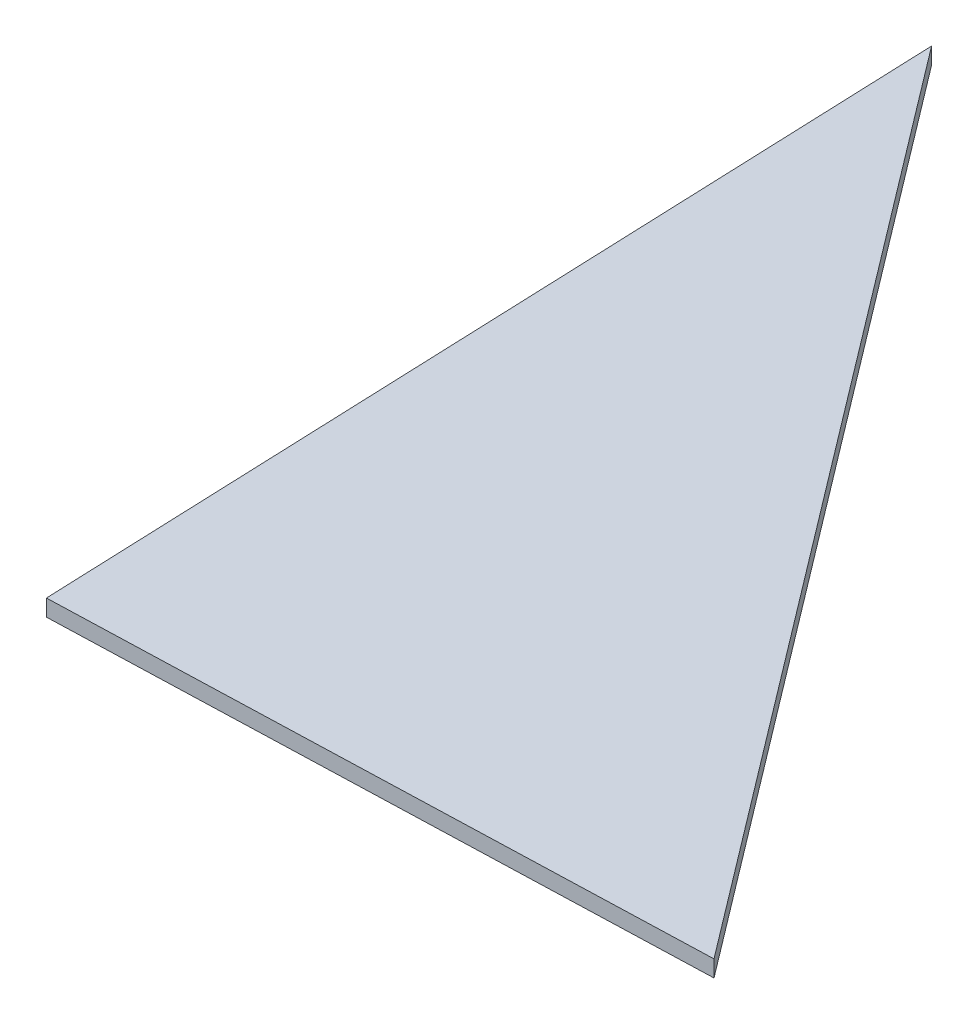
ISO-10303-21;
HEADER;
FILE_DESCRIPTION(('STEP AP214'),'2;1');
FILE_NAME('part.step','',(''),(''),'','','');
FILE_SCHEMA(('AUTOMOTIVE_DESIGN { 1 0 10303 214 1 1 1 1 }'));
ENDSEC;
DATA;
#1=APPLICATION_CONTEXT('core data for automotive mechanical design processes');
#2=APPLICATION_PROTOCOL_DEFINITION('international standard','automotive_design',2000,#1);
#3=PRODUCT_CONTEXT('',#1,'mechanical');
#4=PRODUCT('Part','Part','',(#3));
#5=PRODUCT_RELATED_PRODUCT_CATEGORY('part','',(#4));
#6=PRODUCT_DEFINITION_FORMATION('','',#4);
#7=PRODUCT_DEFINITION_CONTEXT('part definition',#1,'design');
#8=PRODUCT_DEFINITION('design','',#6,#7);
#9=PRODUCT_DEFINITION_SHAPE('','',#8);
#10=(LENGTH_UNIT() NAMED_UNIT(*) SI_UNIT(.MILLI.,.METRE.));
#11=(NAMED_UNIT(*) PLANE_ANGLE_UNIT() SI_UNIT($,.RADIAN.));
#12=(NAMED_UNIT(*) SI_UNIT($,.STERADIAN.) SOLID_ANGLE_UNIT());
#13=UNCERTAINTY_MEASURE_WITH_UNIT(LENGTH_MEASURE(1.E-05),#10,'distance_accuracy_value','');
#14=(GEOMETRIC_REPRESENTATION_CONTEXT(3) GLOBAL_UNCERTAINTY_ASSIGNED_CONTEXT((#13)) GLOBAL_UNIT_ASSIGNED_CONTEXT((#10,
#11,#12)) REPRESENTATION_CONTEXT('',''));
#15=CARTESIAN_POINT('',(0.,0.,0.));
#16=DIRECTION('',(0.,0.,1.));
#17=DIRECTION('',(1.,0.,0.));
#18=AXIS2_PLACEMENT_3D('',#15,#16,#17);
#19=CARTESIAN_POINT('',(0.,2.286,0.));
#20=DIRECTION('',(-0.796905171531975,0.,0.604104417783543));
#21=DIRECTION('',(0.604104417783543,0.,0.796905171531975));
#22=AXIS2_PLACEMENT_3D('',#19,#20,#21);
#23=PLANE('',#22);
#24=DIRECTION('',(-0.604104417783543,0.,-0.796905171531975));
#25=VECTOR('',#24,1.);
#26=CARTESIAN_POINT('',(0.,0.,0.));
#27=LINE('',#26,#25);
#28=CARTESIAN_POINT('',(94.0480269749519,0.,124.063583815029));
#29=VERTEX_POINT('',#28);
#30=CARTESIAN_POINT('',(0.,0.,0.));
#31=VERTEX_POINT('',#30);
#32=EDGE_CURVE('E79',#29,#31,#27,.T.);
#33=ORIENTED_EDGE('',*,*,#32,.T.);
#34=DIRECTION('',(0.,-1.,0.));
#35=VECTOR('',#34,1.);
#36=CARTESIAN_POINT('',(0.,2.286,0.));
#37=LINE('',#36,#35);
#38=CARTESIAN_POINT('',(0.,2.286,0.));
#39=VERTEX_POINT('',#38);
#40=EDGE_CURVE('E11',#39,#31,#37,.T.);
#41=ORIENTED_EDGE('',*,*,#40,.F.);
#42=DIRECTION('',(-0.604104417783543,0.,-0.796905171531975));
#43=VECTOR('',#42,1.);
#44=CARTESIAN_POINT('',(0.,2.286,0.));
#45=LINE('',#44,#43);
#46=CARTESIAN_POINT('',(94.0480269749519,2.286,124.063583815029));
#47=VERTEX_POINT('',#46);
#48=EDGE_CURVE('E72',#47,#39,#45,.T.);
#49=ORIENTED_EDGE('',*,*,#48,.F.);
#50=DIRECTION('',(0.,-1.,0.));
#51=VECTOR('',#50,1.);
#52=CARTESIAN_POINT('',(94.0480269749519,2.286,124.063583815029));
#53=LINE('',#52,#51);
#54=EDGE_CURVE('E80',#47,#29,#53,.T.);
#55=ORIENTED_EDGE('',*,*,#54,.T.);
#56=EDGE_LOOP('',(#33,#41,#49,#55));
#57=FACE_BOUND('',#56,.T.);
#58=ADVANCED_FACE('F32',(#57),#23,.F.);
#59=CARTESIAN_POINT('',(0.,2.286,0.));
#60=DIRECTION('',(0.999258327946889,0.,-0.0385070646607665));
#61=DIRECTION('',(-0.0385070646607666,0.,-0.999258327946889));
#62=AXIS2_PLACEMENT_3D('',#59,#60,#61);
#63=PLANE('',#62);
#64=DIRECTION('',(0.0385070646607665,0.,0.999258327946889));
#65=VECTOR('',#64,1.);
#66=CARTESIAN_POINT('',(0.,0.,0.));
#67=LINE('',#66,#65);
#68=CARTESIAN_POINT('',(4.89402697495185,0.,127.));
#69=VERTEX_POINT('',#68);
#70=EDGE_CURVE('E60',#31,#69,#67,.T.);
#71=ORIENTED_EDGE('',*,*,#70,.T.);
#72=DIRECTION('',(0.,-1.,0.));
#73=VECTOR('',#72,1.);
#74=CARTESIAN_POINT('',(4.89402697495185,2.286,127.));
#75=LINE('',#74,#73);
#76=CARTESIAN_POINT('',(4.89402697495185,2.286,127.));
#77=VERTEX_POINT('',#76);
#78=EDGE_CURVE('E40',#77,#69,#75,.T.);
#79=ORIENTED_EDGE('',*,*,#78,.F.);
#80=DIRECTION('',(0.0385070646607665,0.,0.999258327946889));
#81=VECTOR('',#80,1.);
#82=CARTESIAN_POINT('',(0.,2.286,0.));
#83=LINE('',#82,#81);
#84=EDGE_CURVE('E68',#39,#77,#83,.T.);
#85=ORIENTED_EDGE('',*,*,#84,.F.);
#86=ORIENTED_EDGE('',*,*,#40,.T.);
#87=EDGE_LOOP('',(#71,#79,#85,#86));
#88=FACE_BOUND('',#87,.T.);
#89=ADVANCED_FACE('F69',(#88),#63,.F.);
#90=CARTESIAN_POINT('',(4.89402697495185,2.286,127.));
#91=DIRECTION('',(-0.0329185987538692,0.,-0.999458036065588));
#92=DIRECTION('',(-0.999458036065588,0.,0.0329185987538692));
#93=AXIS2_PLACEMENT_3D('',#90,#91,#92);
#94=PLANE('',#93);
#95=DIRECTION('',(0.999458036065588,0.,-0.0329185987538692));
#96=VECTOR('',#95,1.);
#97=CARTESIAN_POINT('',(4.89402697495185,0.,127.));
#98=LINE('',#97,#96);
#99=EDGE_CURVE('E65',#69,#29,#98,.T.);
#100=ORIENTED_EDGE('',*,*,#99,.T.);
#101=ORIENTED_EDGE('',*,*,#54,.F.);
#102=DIRECTION('',(0.999458036065588,0.,-0.0329185987538692));
#103=VECTOR('',#102,1.);
#104=CARTESIAN_POINT('',(4.89402697495185,2.286,127.));
#105=LINE('',#104,#103);
#106=EDGE_CURVE('E48',#77,#47,#105,.T.);
#107=ORIENTED_EDGE('',*,*,#106,.F.);
#108=ORIENTED_EDGE('',*,*,#78,.T.);
#109=EDGE_LOOP('',(#100,#101,#107,#108));
#110=FACE_BOUND('',#109,.T.);
#111=ADVANCED_FACE('F87',(#110),#94,.F.);
#112=CARTESIAN_POINT('',(0.,2.286,0.));
#113=DIRECTION('',(0.,1.,0.));
#114=DIRECTION('',(0.,0.,1.));
#115=AXIS2_PLACEMENT_3D('',#112,#113,#114);
#116=PLANE('',#115);
#117=ORIENTED_EDGE('',*,*,#48,.T.);
#118=ORIENTED_EDGE('',*,*,#84,.T.);
#119=ORIENTED_EDGE('',*,*,#106,.T.);
#120=EDGE_LOOP('',(#117,#118,#119));
#121=FACE_BOUND('',#120,.T.);
#122=ADVANCED_FACE('F75',(#121),#116,.T.);
#123=CARTESIAN_POINT('',(0.,0.,0.));
#124=DIRECTION('',(0.,1.,0.));
#125=DIRECTION('',(0.,0.,1.));
#126=AXIS2_PLACEMENT_3D('',#123,#124,#125);
#127=PLANE('',#126);
#128=ORIENTED_EDGE('',*,*,#32,.F.);
#129=ORIENTED_EDGE('',*,*,#99,.F.);
#130=ORIENTED_EDGE('',*,*,#70,.F.);
#131=EDGE_LOOP('',(#128,#129,#130));
#132=FACE_BOUND('',#131,.T.);
#133=ADVANCED_FACE('F88',(#132),#127,.F.);
#134=CLOSED_SHELL('',(#58,#89,#111,#122,#133));
#135=MANIFOLD_SOLID_BREP('B2',#134);
#136=ADVANCED_BREP_SHAPE_REPRESENTATION('',(#18,#135),#14);
#137=SHAPE_DEFINITION_REPRESENTATION(#9,#136);
ENDSEC;
END-ISO-10303-21;
